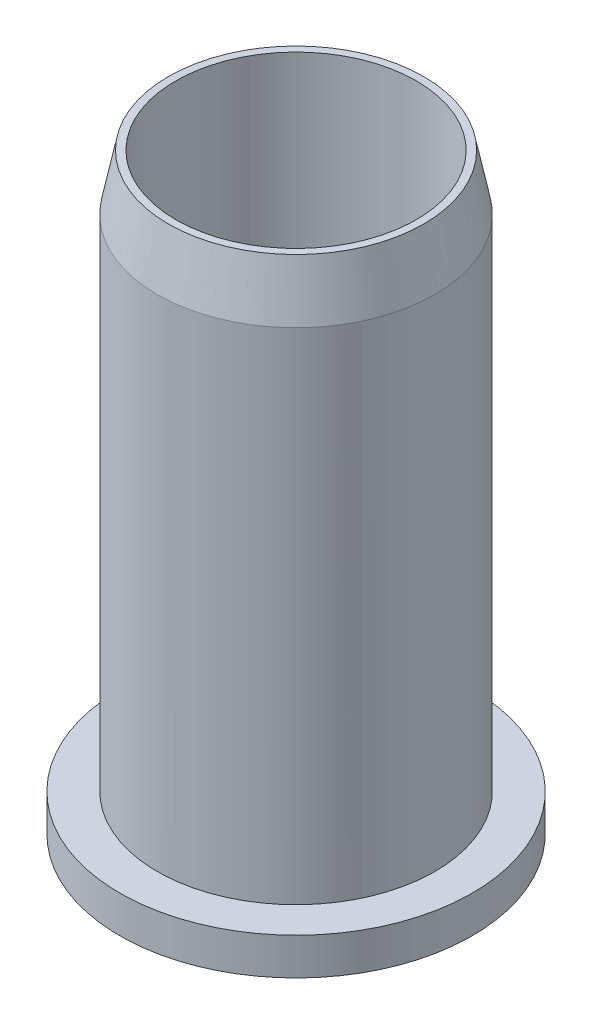
ISO-10303-21;
HEADER;
FILE_DESCRIPTION(('STEP AP214'),'2;1');
FILE_NAME('part.step','',(''),(''),'','','');
FILE_SCHEMA(('AUTOMOTIVE_DESIGN { 1 0 10303 214 1 1 1 1 }'));
ENDSEC;
DATA;
#1=APPLICATION_CONTEXT('core data for automotive mechanical design processes');
#2=APPLICATION_PROTOCOL_DEFINITION('international standard','automotive_design',2000,#1);
#3=PRODUCT_CONTEXT('',#1,'mechanical');
#4=PRODUCT('Part','Part','',(#3));
#5=PRODUCT_RELATED_PRODUCT_CATEGORY('part','',(#4));
#6=PRODUCT_DEFINITION_FORMATION('','',#4);
#7=PRODUCT_DEFINITION_CONTEXT('part definition',#1,'design');
#8=PRODUCT_DEFINITION('design','',#6,#7);
#9=PRODUCT_DEFINITION_SHAPE('','',#8);
#10=(LENGTH_UNIT() NAMED_UNIT(*) SI_UNIT(.MILLI.,.METRE.));
#11=(NAMED_UNIT(*) PLANE_ANGLE_UNIT() SI_UNIT($,.RADIAN.));
#12=(NAMED_UNIT(*) SI_UNIT($,.STERADIAN.) SOLID_ANGLE_UNIT());
#13=UNCERTAINTY_MEASURE_WITH_UNIT(LENGTH_MEASURE(1.E-05),#10,'distance_accuracy_value','');
#14=(GEOMETRIC_REPRESENTATION_CONTEXT(3) GLOBAL_UNCERTAINTY_ASSIGNED_CONTEXT((#13)) GLOBAL_UNIT_ASSIGNED_CONTEXT((#10,
#11,#12)) REPRESENTATION_CONTEXT('',''));
#15=CARTESIAN_POINT('',(0.,0.,0.));
#16=DIRECTION('',(0.,0.,1.));
#17=DIRECTION('',(1.,0.,0.));
#18=AXIS2_PLACEMENT_3D('',#15,#16,#17);
#19=CARTESIAN_POINT('',(0.,0.,0.));
#20=DIRECTION('',(0.,-1.,0.));
#21=DIRECTION('',(0.,0.,-1.));
#22=AXIS2_PLACEMENT_3D('',#19,#20,#21);
#23=CYLINDRICAL_SURFACE('',#22,3.25);
#24=CARTESIAN_POINT('',(0.,0.,0.));
#25=DIRECTION('',(0.,-1.,0.));
#26=DIRECTION('',(0.,0.,-1.));
#27=AXIS2_PLACEMENT_3D('',#24,#25,#26);
#28=CIRCLE('',#27,3.25);
#29=CARTESIAN_POINT('',(0.,0.,-3.25));
#30=VERTEX_POINT('',#29);
#31=EDGE_CURVE('E57',#30,#30,#28,.T.);
#32=ORIENTED_EDGE('',*,*,#31,.T.);
#33=EDGE_LOOP('',(#32));
#34=FACE_BOUND('',#33,.T.);
#35=CARTESIAN_POINT('',(0.,16.,0.));
#36=DIRECTION('',(0.,-1.,0.));
#37=DIRECTION('',(0.,0.,-1.));
#38=AXIS2_PLACEMENT_3D('',#35,#36,#37);
#39=CIRCLE('',#38,3.25);
#40=CARTESIAN_POINT('',(0.,16.,-3.25));
#41=VERTEX_POINT('',#40);
#42=EDGE_CURVE('E42',#41,#41,#39,.T.);
#43=ORIENTED_EDGE('',*,*,#42,.F.);
#44=EDGE_LOOP('',(#43));
#45=FACE_BOUND('',#44,.T.);
#46=ADVANCED_FACE('F31',(#34,#45),#23,.F.);
#47=CARTESIAN_POINT('',(3.25,16.,0.));
#48=DIRECTION('',(0.,1.,0.));
#49=DIRECTION('',(0.,0.,1.));
#50=AXIS2_PLACEMENT_3D('',#47,#48,#49);
#51=PLANE('',#50);
#52=CARTESIAN_POINT('',(0.,16.,0.));
#53=DIRECTION('',(0.,1.,0.));
#54=DIRECTION('',(0.,0.,1.));
#55=AXIS2_PLACEMENT_3D('',#52,#53,#54);
#56=CIRCLE('',#55,3.44999999999999);
#57=CARTESIAN_POINT('',(0.,16.,3.44999999999999));
#58=VERTEX_POINT('',#57);
#59=EDGE_CURVE('E10',#58,#58,#56,.T.);
#60=ORIENTED_EDGE('',*,*,#59,.T.);
#61=EDGE_LOOP('',(#60));
#62=FACE_BOUND('',#61,.T.);
#63=ORIENTED_EDGE('',*,*,#42,.T.);
#64=EDGE_LOOP('',(#63));
#65=FACE_BOUND('',#64,.T.);
#66=ADVANCED_FACE('F77',(#62,#65),#51,.T.);
#67=CARTESIAN_POINT('',(0.,0.,0.));
#68=DIRECTION('',(0.,-1.,0.));
#69=DIRECTION('',(0.,0.,-1.));
#70=AXIS2_PLACEMENT_3D('',#67,#68,#69);
#71=CYLINDRICAL_SURFACE('',#70,3.75);
#72=CARTESIAN_POINT('',(0.,14.4999999999999,0.));
#73=DIRECTION('',(0.,1.,0.));
#74=DIRECTION('',(0.,0.,1.));
#75=AXIS2_PLACEMENT_3D('',#72,#73,#74);
#76=CIRCLE('',#75,3.75);
#77=CARTESIAN_POINT('',(0.,14.4999999999999,3.75));
#78=VERTEX_POINT('',#77);
#79=EDGE_CURVE('E38',#78,#78,#76,.F.);
#80=ORIENTED_EDGE('',*,*,#79,.T.);
#81=EDGE_LOOP('',(#80));
#82=FACE_BOUND('',#81,.T.);
#83=CARTESIAN_POINT('',(0.,1.,0.));
#84=DIRECTION('',(0.,-1.,0.));
#85=DIRECTION('',(0.,0.,-1.));
#86=AXIS2_PLACEMENT_3D('',#83,#84,#85);
#87=CIRCLE('',#86,3.75);
#88=CARTESIAN_POINT('',(0.,1.,-3.75));
#89=VERTEX_POINT('',#88);
#90=EDGE_CURVE('E46',#89,#89,#87,.T.);
#91=ORIENTED_EDGE('',*,*,#90,.F.);
#92=EDGE_LOOP('',(#91));
#93=FACE_BOUND('',#92,.T.);
#94=ADVANCED_FACE('F82',(#82,#93),#71,.T.);
#95=CARTESIAN_POINT('',(3.75,1.,0.));
#96=DIRECTION('',(0.,1.,0.));
#97=DIRECTION('',(0.,0.,1.));
#98=AXIS2_PLACEMENT_3D('',#95,#96,#97);
#99=PLANE('',#98);
#100=ORIENTED_EDGE('',*,*,#90,.T.);
#101=EDGE_LOOP('',(#100));
#102=FACE_BOUND('',#101,.T.);
#103=CARTESIAN_POINT('',(0.,1.,0.));
#104=DIRECTION('',(0.,-1.,0.));
#105=DIRECTION('',(0.,0.,-1.));
#106=AXIS2_PLACEMENT_3D('',#103,#104,#105);
#107=CIRCLE('',#106,4.76);
#108=CARTESIAN_POINT('',(0.,1.,-4.76));
#109=VERTEX_POINT('',#108);
#110=EDGE_CURVE('E51',#109,#109,#107,.T.);
#111=ORIENTED_EDGE('',*,*,#110,.F.);
#112=EDGE_LOOP('',(#111));
#113=FACE_BOUND('',#112,.T.);
#114=ADVANCED_FACE('F73',(#102,#113),#99,.T.);
#115=CARTESIAN_POINT('',(0.,0.,0.));
#116=DIRECTION('',(0.,-1.,0.));
#117=DIRECTION('',(0.,0.,-1.));
#118=AXIS2_PLACEMENT_3D('',#115,#116,#117);
#119=CYLINDRICAL_SURFACE('',#118,4.76);
#120=ORIENTED_EDGE('',*,*,#110,.T.);
#121=EDGE_LOOP('',(#120));
#122=FACE_BOUND('',#121,.T.);
#123=CARTESIAN_POINT('',(0.,0.,0.));
#124=DIRECTION('',(0.,-1.,0.));
#125=DIRECTION('',(0.,0.,-1.));
#126=AXIS2_PLACEMENT_3D('',#123,#124,#125);
#127=CIRCLE('',#126,4.76);
#128=CARTESIAN_POINT('',(0.,0.,-4.76));
#129=VERTEX_POINT('',#128);
#130=EDGE_CURVE('E54',#129,#129,#127,.T.);
#131=ORIENTED_EDGE('',*,*,#130,.F.);
#132=EDGE_LOOP('',(#131));
#133=FACE_BOUND('',#132,.T.);
#134=ADVANCED_FACE('F65',(#122,#133),#119,.T.);
#135=CARTESIAN_POINT('',(4.76,0.,0.));
#136=DIRECTION('',(0.,-1.,0.));
#137=DIRECTION('',(0.,0.,-1.));
#138=AXIS2_PLACEMENT_3D('',#135,#136,#137);
#139=PLANE('',#138);
#140=ORIENTED_EDGE('',*,*,#130,.T.);
#141=EDGE_LOOP('',(#140));
#142=FACE_BOUND('',#141,.T.);
#143=ORIENTED_EDGE('',*,*,#31,.F.);
#144=EDGE_LOOP('',(#143));
#145=FACE_BOUND('',#144,.T.);
#146=ADVANCED_FACE('F63',(#142,#145),#139,.T.);
#147=CARTESIAN_POINT('',(0.,14.4999999999999,0.));
#148=DIRECTION('',(0.,-1.,0.));
#149=DIRECTION('',(0.,0.,-1.));
#150=AXIS2_PLACEMENT_3D('',#147,#148,#149);
#151=CONICAL_SURFACE('',#150,3.75,0.197395559849877);
#152=ORIENTED_EDGE('',*,*,#59,.F.);
#153=EDGE_LOOP('',(#152));
#154=FACE_BOUND('',#153,.T.);
#155=ORIENTED_EDGE('',*,*,#79,.F.);
#156=EDGE_LOOP('',(#155));
#157=FACE_BOUND('',#156,.T.);
#158=ADVANCED_FACE('F33',(#154,#157),#151,.T.);
#159=CLOSED_SHELL('',(#46,#66,#94,#114,#134,#146,#158));
#160=MANIFOLD_SOLID_BREP('B2',#159);
#161=ADVANCED_BREP_SHAPE_REPRESENTATION('',(#18,#160),#14);
#162=SHAPE_DEFINITION_REPRESENTATION(#9,#161);
ENDSEC;
END-ISO-10303-21;
